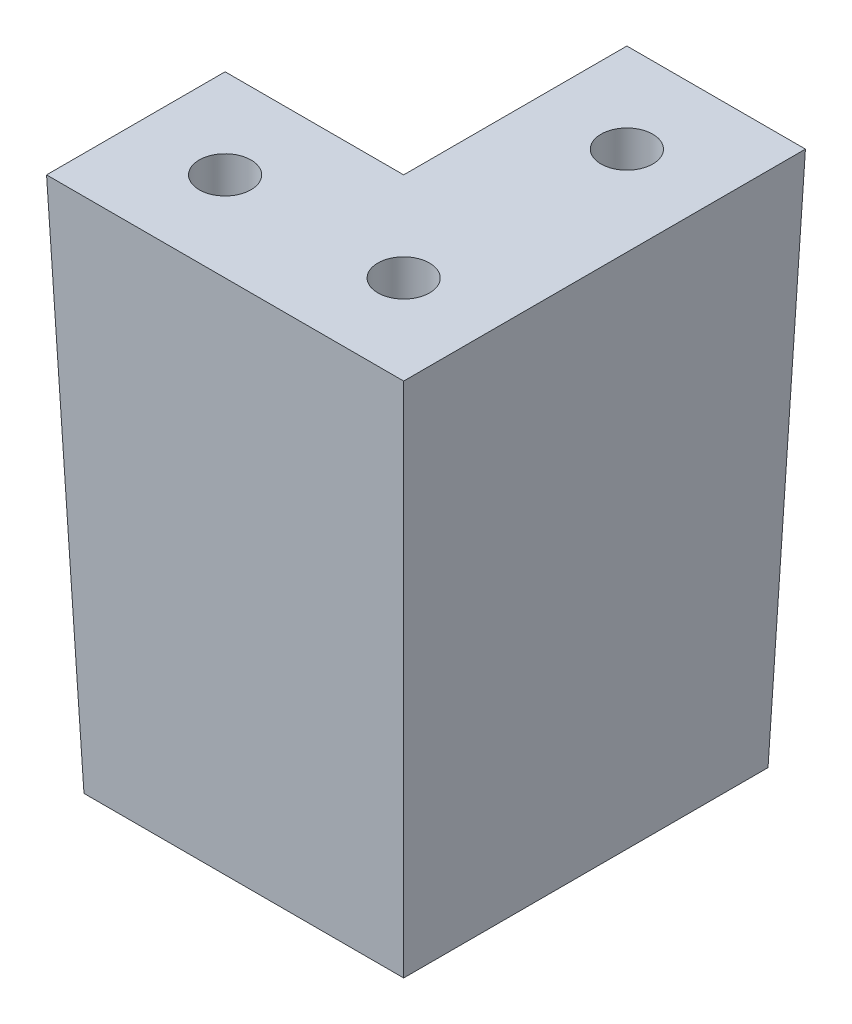
ISO-10303-21;
HEADER;
FILE_DESCRIPTION(('STEP AP214'),'2;1');
FILE_NAME('part.step','',(''),(''),'','','');
FILE_SCHEMA(('AUTOMOTIVE_DESIGN { 1 0 10303 214 1 1 1 1 }'));
ENDSEC;
DATA;
#1=APPLICATION_CONTEXT('core data for automotive mechanical design processes');
#2=APPLICATION_PROTOCOL_DEFINITION('international standard','automotive_design',2000,#1);
#3=PRODUCT_CONTEXT('',#1,'mechanical');
#4=PRODUCT('Part','Part','',(#3));
#5=PRODUCT_RELATED_PRODUCT_CATEGORY('part','',(#4));
#6=PRODUCT_DEFINITION_FORMATION('','',#4);
#7=PRODUCT_DEFINITION_CONTEXT('part definition',#1,'design');
#8=PRODUCT_DEFINITION('design','',#6,#7);
#9=PRODUCT_DEFINITION_SHAPE('','',#8);
#10=(LENGTH_UNIT() NAMED_UNIT(*) SI_UNIT(.MILLI.,.METRE.));
#11=(NAMED_UNIT(*) PLANE_ANGLE_UNIT() SI_UNIT($,.RADIAN.));
#12=(NAMED_UNIT(*) SI_UNIT($,.STERADIAN.) SOLID_ANGLE_UNIT());
#13=UNCERTAINTY_MEASURE_WITH_UNIT(LENGTH_MEASURE(1.E-05),#10,'distance_accuracy_value','');
#14=(GEOMETRIC_REPRESENTATION_CONTEXT(3) GLOBAL_UNCERTAINTY_ASSIGNED_CONTEXT((#13)) GLOBAL_UNIT_ASSIGNED_CONTEXT((#10,
#11,#12)) REPRESENTATION_CONTEXT('',''));
#15=CARTESIAN_POINT('',(0.,0.,0.));
#16=DIRECTION('',(0.,0.,1.));
#17=DIRECTION('',(1.,0.,0.));
#18=AXIS2_PLACEMENT_3D('',#15,#16,#17);
#19=CARTESIAN_POINT('',(0.,0.,0.));
#20=DIRECTION('',(-0.999390827019096,-0.034899496702501,0.));
#21=DIRECTION('',(0.034899496702501,-0.999390827019096,0.));
#22=AXIS2_PLACEMENT_3D('',#19,#20,#21);
#23=PLANE('',#22);
#24=DIRECTION('',(0.,0.,1.));
#25=VECTOR('',#24,1.);
#26=CARTESIAN_POINT('',(0.,0.,0.));
#27=LINE('',#26,#25);
#28=CARTESIAN_POINT('',(0.,0.,-20.));
#29=VERTEX_POINT('',#28);
#30=CARTESIAN_POINT('',(0.,0.,0.));
#31=VERTEX_POINT('',#30);
#32=EDGE_CURVE('E111',#29,#31,#27,.T.);
#33=ORIENTED_EDGE('',*,*,#32,.F.);
#34=DIRECTION('',(-0.0348782627423747,0.998782765958718,-0.0348782627423747));
#35=VECTOR('',#34,1.);
#36=CARTESIAN_POINT('',(0.,0.,-20.));
#37=LINE('',#36,#35);
#38=CARTESIAN_POINT('',(2.09524616950487,-60.,-17.9047538304951));
#39=VERTEX_POINT('',#38);
#40=EDGE_CURVE('E11',#39,#29,#37,.T.);
#41=ORIENTED_EDGE('',*,*,#40,.F.);
#42=DIRECTION('',(0.,0.,1.));
#43=VECTOR('',#42,1.);
#44=CARTESIAN_POINT('',(2.09524616950487,-60.,0.));
#45=LINE('',#44,#43);
#46=CARTESIAN_POINT('',(2.09524616950487,-60.,-2.09524616950487));
#47=VERTEX_POINT('',#46);
#48=EDGE_CURVE('E113',#39,#47,#45,.T.);
#49=ORIENTED_EDGE('',*,*,#48,.T.);
#50=DIRECTION('',(-0.0348782627423747,0.998782765958718,0.0348782627423747));
#51=VECTOR('',#50,1.);
#52=CARTESIAN_POINT('',(0.,0.,0.));
#53=LINE('',#52,#51);
#54=EDGE_CURVE('E89',#47,#31,#53,.T.);
#55=ORIENTED_EDGE('',*,*,#54,.T.);
#56=EDGE_LOOP('',(#33,#41,#49,#55));
#57=FACE_BOUND('',#56,.T.);
#58=ADVANCED_FACE('F43',(#57),#23,.T.);
#59=CARTESIAN_POINT('',(0.,0.,-20.));
#60=DIRECTION('',(0.,-0.034899496702501,-0.999390827019096));
#61=DIRECTION('',(0.,0.999390827019096,-0.034899496702501));
#62=AXIS2_PLACEMENT_3D('',#59,#60,#61);
#63=PLANE('',#62);
#64=DIRECTION('',(-1.,0.,0.));
#65=VECTOR('',#64,1.);
#66=CARTESIAN_POINT('',(0.,0.,-20.));
#67=LINE('',#66,#65);
#68=CARTESIAN_POINT('',(20.,0.,-20.));
#69=VERTEX_POINT('',#68);
#70=EDGE_CURVE('E126',#69,#29,#67,.T.);
#71=ORIENTED_EDGE('',*,*,#70,.F.);
#72=DIRECTION('',(-0.0348782627423747,0.998782765958718,-0.0348782627423747));
#73=VECTOR('',#72,1.);
#74=CARTESIAN_POINT('',(19.9756701357615,0.696716154673278,-20.0243298642385));
#75=LINE('',#74,#73);
#76=CARTESIAN_POINT('',(22.0952461695049,-60.,-17.9047538304951));
#77=VERTEX_POINT('',#76);
#78=EDGE_CURVE('E54',#77,#69,#75,.T.);
#79=ORIENTED_EDGE('',*,*,#78,.F.);
#80=DIRECTION('',(-1.,0.,0.));
#81=VECTOR('',#80,1.);
#82=CARTESIAN_POINT('',(0.,-60.,-17.9047538304951));
#83=LINE('',#82,#81);
#84=EDGE_CURVE('E115',#77,#39,#83,.T.);
#85=ORIENTED_EDGE('',*,*,#84,.T.);
#86=ORIENTED_EDGE('',*,*,#40,.T.);
#87=EDGE_LOOP('',(#71,#79,#85,#86));
#88=FACE_BOUND('',#87,.T.);
#89=ADVANCED_FACE('F45',(#88),#63,.T.);
#90=CARTESIAN_POINT('',(20.,0.,-45.));
#91=DIRECTION('',(-0.999390827019096,-0.034899496702501,0.));
#92=DIRECTION('',(0.034899496702501,-0.999390827019096,0.));
#93=AXIS2_PLACEMENT_3D('',#90,#91,#92);
#94=PLANE('',#93);
#95=DIRECTION('',(0.,0.,1.));
#96=VECTOR('',#95,1.);
#97=CARTESIAN_POINT('',(20.,0.,-45.));
#98=LINE('',#97,#96);
#99=CARTESIAN_POINT('',(20.,0.,-45.));
#100=VERTEX_POINT('',#99);
#101=EDGE_CURVE('E142',#100,#69,#98,.T.);
#102=ORIENTED_EDGE('',*,*,#101,.F.);
#103=DIRECTION('',(-0.0348782627423747,0.998782765958718,-0.0348782627423747));
#104=VECTOR('',#103,1.);
#105=CARTESIAN_POINT('',(20.,0.,-45.));
#106=LINE('',#105,#104);
#107=CARTESIAN_POINT('',(22.0952461695049,-60.,-42.9047538304951));
#108=VERTEX_POINT('',#107);
#109=EDGE_CURVE('E152',#108,#100,#106,.T.);
#110=ORIENTED_EDGE('',*,*,#109,.F.);
#111=DIRECTION('',(0.,0.,1.));
#112=VECTOR('',#111,1.);
#113=CARTESIAN_POINT('',(22.0952461695049,-60.,-45.));
#114=LINE('',#113,#112);
#115=EDGE_CURVE('E161',#108,#77,#114,.T.);
#116=ORIENTED_EDGE('',*,*,#115,.T.);
#117=ORIENTED_EDGE('',*,*,#78,.T.);
#118=EDGE_LOOP('',(#102,#110,#116,#117));
#119=FACE_BOUND('',#118,.T.);
#120=ADVANCED_FACE('F179',(#119),#94,.T.);
#121=CARTESIAN_POINT('',(20.,0.,-45.));
#122=DIRECTION('',(0.,-0.034899496702501,-0.999390827019096));
#123=DIRECTION('',(0.,0.999390827019096,-0.034899496702501));
#124=AXIS2_PLACEMENT_3D('',#121,#122,#123);
#125=PLANE('',#124);
#126=DIRECTION('',(-1.,0.,0.));
#127=VECTOR('',#126,1.);
#128=CARTESIAN_POINT('',(20.,0.,-45.));
#129=LINE('',#128,#127);
#130=CARTESIAN_POINT('',(40.,0.,-45.));
#131=VERTEX_POINT('',#130);
#132=EDGE_CURVE('E138',#131,#100,#129,.T.);
#133=ORIENTED_EDGE('',*,*,#132,.F.);
#134=DIRECTION('',(0.0348782627423747,0.998782765958718,-0.0348782627423747));
#135=VECTOR('',#134,1.);
#136=CARTESIAN_POINT('',(39.9452578054633,-1.56761134801487,-44.9452578054633));
#137=LINE('',#136,#135);
#138=CARTESIAN_POINT('',(37.9047538304951,-60.,-42.9047538304951));
#139=VERTEX_POINT('',#138);
#140=EDGE_CURVE('E149',#139,#131,#137,.T.);
#141=ORIENTED_EDGE('',*,*,#140,.F.);
#142=DIRECTION('',(-1.,0.,0.));
#143=VECTOR('',#142,1.);
#144=CARTESIAN_POINT('',(20.,-60.,-42.9047538304951));
#145=LINE('',#144,#143);
#146=EDGE_CURVE('E164',#139,#108,#145,.T.);
#147=ORIENTED_EDGE('',*,*,#146,.T.);
#148=ORIENTED_EDGE('',*,*,#109,.T.);
#149=EDGE_LOOP('',(#133,#141,#147,#148));
#150=FACE_BOUND('',#149,.T.);
#151=ADVANCED_FACE('F177',(#150),#125,.T.);
#152=CARTESIAN_POINT('',(40.,0.,0.));
#153=DIRECTION('',(0.999390827019096,-0.034899496702501,0.));
#154=DIRECTION('',(0.034899496702501,0.999390827019096,0.));
#155=AXIS2_PLACEMENT_3D('',#152,#153,#154);
#156=PLANE('',#155);
#157=DIRECTION('',(0.,0.,-1.));
#158=VECTOR('',#157,1.);
#159=CARTESIAN_POINT('',(40.,0.,0.));
#160=LINE('',#159,#158);
#161=CARTESIAN_POINT('',(40.,0.,0.));
#162=VERTEX_POINT('',#161);
#163=EDGE_CURVE('E123',#162,#131,#160,.T.);
#164=ORIENTED_EDGE('',*,*,#163,.F.);
#165=DIRECTION('',(0.0348782627423747,0.998782765958718,0.0348782627423747));
#166=VECTOR('',#165,1.);
#167=CARTESIAN_POINT('',(39.951340271523,-1.39343230934656,-0.0486597284770448));
#168=LINE('',#167,#166);
#169=CARTESIAN_POINT('',(37.9047538304951,-60.,-2.09524616950487));
#170=VERTEX_POINT('',#169);
#171=EDGE_CURVE('E81',#170,#162,#168,.T.);
#172=ORIENTED_EDGE('',*,*,#171,.F.);
#173=DIRECTION('',(0.,0.,-1.));
#174=VECTOR('',#173,1.);
#175=CARTESIAN_POINT('',(37.9047538304951,-60.,0.));
#176=LINE('',#175,#174);
#177=EDGE_CURVE('E167',#170,#139,#176,.T.);
#178=ORIENTED_EDGE('',*,*,#177,.T.);
#179=ORIENTED_EDGE('',*,*,#140,.T.);
#180=EDGE_LOOP('',(#164,#172,#178,#179));
#181=FACE_BOUND('',#180,.T.);
#182=ADVANCED_FACE('F178',(#181),#156,.T.);
#183=CARTESIAN_POINT('',(0.,0.,0.));
#184=DIRECTION('',(0.,-0.034899496702501,0.999390827019096));
#185=DIRECTION('',(0.,-0.999390827019096,-0.034899496702501));
#186=AXIS2_PLACEMENT_3D('',#183,#184,#185);
#187=PLANE('',#186);
#188=DIRECTION('',(1.,0.,0.));
#189=VECTOR('',#188,1.);
#190=CARTESIAN_POINT('',(0.,0.,0.));
#191=LINE('',#190,#189);
#192=EDGE_CURVE('E118',#31,#162,#191,.T.);
#193=ORIENTED_EDGE('',*,*,#192,.F.);
#194=ORIENTED_EDGE('',*,*,#54,.F.);
#195=DIRECTION('',(1.,0.,0.));
#196=VECTOR('',#195,1.);
#197=CARTESIAN_POINT('',(0.,-60.,-2.09524616950487));
#198=LINE('',#197,#196);
#199=EDGE_CURVE('E47',#47,#170,#198,.T.);
#200=ORIENTED_EDGE('',*,*,#199,.T.);
#201=ORIENTED_EDGE('',*,*,#171,.T.);
#202=EDGE_LOOP('',(#193,#194,#200,#201));
#203=FACE_BOUND('',#202,.T.);
#204=ADVANCED_FACE('F119',(#203),#187,.T.);
#205=CARTESIAN_POINT('',(0.,-60.,0.));
#206=DIRECTION('',(0.,-1.,0.));
#207=DIRECTION('',(0.,0.,-1.));
#208=AXIS2_PLACEMENT_3D('',#205,#206,#207);
#209=PLANE('',#208);
#210=CARTESIAN_POINT('',(30.0000000000011,-60.,-10.));
#211=DIRECTION('',(0.,-1.,0.));
#212=DIRECTION('',(0.,0.,-1.));
#213=AXIS2_PLACEMENT_3D('',#210,#211,#212);
#214=CIRCLE('',#213,5.74999999999999);
#215=CARTESIAN_POINT('',(30.0000000000011,-60.,-15.75));
#216=VERTEX_POINT('',#215);
#217=EDGE_CURVE('E342',#216,#216,#214,.T.);
#218=ORIENTED_EDGE('',*,*,#217,.F.);
#219=EDGE_LOOP('',(#218));
#220=FACE_BOUND('',#219,.T.);
#221=CARTESIAN_POINT('',(9.99999999999545,-60.,-10.));
#222=DIRECTION('',(0.,-1.,0.));
#223=DIRECTION('',(0.,0.,-1.));
#224=AXIS2_PLACEMENT_3D('',#221,#222,#223);
#225=CIRCLE('',#224,5.74999999999999);
#226=CARTESIAN_POINT('',(9.99999999999545,-60.,-15.75));
#227=VERTEX_POINT('',#226);
#228=EDGE_CURVE('E356',#227,#227,#225,.T.);
#229=ORIENTED_EDGE('',*,*,#228,.F.);
#230=EDGE_LOOP('',(#229));
#231=FACE_BOUND('',#230,.T.);
#232=CARTESIAN_POINT('',(30.0000000007019,-60.,-35.));
#233=DIRECTION('',(0.,-1.,0.));
#234=DIRECTION('',(0.,0.,-1.));
#235=AXIS2_PLACEMENT_3D('',#232,#233,#234);
#236=CIRCLE('',#235,5.75);
#237=CARTESIAN_POINT('',(30.0000000007019,-60.,-40.75));
#238=VERTEX_POINT('',#237);
#239=EDGE_CURVE('E372',#238,#238,#236,.T.);
#240=ORIENTED_EDGE('',*,*,#239,.F.);
#241=EDGE_LOOP('',(#240));
#242=FACE_BOUND('',#241,.T.);
#243=ORIENTED_EDGE('',*,*,#48,.F.);
#244=ORIENTED_EDGE('',*,*,#84,.F.);
#245=ORIENTED_EDGE('',*,*,#115,.F.);
#246=ORIENTED_EDGE('',*,*,#146,.F.);
#247=ORIENTED_EDGE('',*,*,#177,.F.);
#248=ORIENTED_EDGE('',*,*,#199,.F.);
#249=EDGE_LOOP('',(#243,#244,#245,#246,#247,#248));
#250=FACE_BOUND('',#249,.T.);
#251=ADVANCED_FACE('F171',(#220,#231,#242,#250),#209,.T.);
#252=CARTESIAN_POINT('',(0.,0.,0.));
#253=DIRECTION('',(0.,-1.,0.));
#254=DIRECTION('',(0.,0.,-1.));
#255=AXIS2_PLACEMENT_3D('',#252,#253,#254);
#256=PLANE('',#255);
#257=CARTESIAN_POINT('',(30.0000000000011,0.,-10.));
#258=DIRECTION('',(0.,-1.,0.));
#259=DIRECTION('',(0.,0.,-1.));
#260=AXIS2_PLACEMENT_3D('',#257,#258,#259);
#261=CIRCLE('',#260,2.89999999999999);
#262=CARTESIAN_POINT('',(30.0000000000011,0.,-12.9));
#263=VERTEX_POINT('',#262);
#264=EDGE_CURVE('E352',#263,#263,#261,.T.);
#265=ORIENTED_EDGE('',*,*,#264,.T.);
#266=EDGE_LOOP('',(#265));
#267=FACE_BOUND('',#266,.T.);
#268=CARTESIAN_POINT('',(9.99999999999545,0.,-10.));
#269=DIRECTION('',(0.,-1.,0.));
#270=DIRECTION('',(0.,0.,-1.));
#271=AXIS2_PLACEMENT_3D('',#268,#269,#270);
#272=CIRCLE('',#271,2.89999999999999);
#273=CARTESIAN_POINT('',(9.99999999999545,0.,-12.9));
#274=VERTEX_POINT('',#273);
#275=EDGE_CURVE('E368',#274,#274,#272,.T.);
#276=ORIENTED_EDGE('',*,*,#275,.T.);
#277=EDGE_LOOP('',(#276));
#278=FACE_BOUND('',#277,.T.);
#279=CARTESIAN_POINT('',(30.0000000007019,0.,-35.));
#280=DIRECTION('',(0.,-1.,0.));
#281=DIRECTION('',(0.,0.,-1.));
#282=AXIS2_PLACEMENT_3D('',#279,#280,#281);
#283=CIRCLE('',#282,2.89999999999999);
#284=CARTESIAN_POINT('',(30.0000000007019,0.,-37.9));
#285=VERTEX_POINT('',#284);
#286=EDGE_CURVE('E128',#285,#285,#283,.T.);
#287=ORIENTED_EDGE('',*,*,#286,.T.);
#288=EDGE_LOOP('',(#287));
#289=FACE_BOUND('',#288,.T.);
#290=ORIENTED_EDGE('',*,*,#32,.T.);
#291=ORIENTED_EDGE('',*,*,#192,.T.);
#292=ORIENTED_EDGE('',*,*,#163,.T.);
#293=ORIENTED_EDGE('',*,*,#132,.T.);
#294=ORIENTED_EDGE('',*,*,#101,.T.);
#295=ORIENTED_EDGE('',*,*,#70,.T.);
#296=EDGE_LOOP('',(#290,#291,#292,#293,#294,#295));
#297=FACE_BOUND('',#296,.T.);
#298=ADVANCED_FACE('F125',(#267,#278,#289,#297),#256,.F.);
#299=CARTESIAN_POINT('',(30.0000000007019,-60.,-35.));
#300=DIRECTION('',(0.,-1.,0.));
#301=DIRECTION('',(0.,0.,-1.));
#302=AXIS2_PLACEMENT_3D('',#299,#300,#301);
#303=CYLINDRICAL_SURFACE('',#302,2.89999999999999);
#304=ORIENTED_EDGE('',*,*,#286,.F.);
#305=EDGE_LOOP('',(#304));
#306=FACE_BOUND('',#305,.T.);
#307=CARTESIAN_POINT('',(30.0000000007019,-5.,-35.));
#308=DIRECTION('',(0.,-1.,0.));
#309=DIRECTION('',(0.,0.,-1.));
#310=AXIS2_PLACEMENT_3D('',#307,#308,#309);
#311=CIRCLE('',#310,2.89999999999999);
#312=CARTESIAN_POINT('',(30.0000000007019,-5.,-37.9));
#313=VERTEX_POINT('',#312);
#314=EDGE_CURVE('E132',#313,#313,#311,.T.);
#315=ORIENTED_EDGE('',*,*,#314,.T.);
#316=EDGE_LOOP('',(#315));
#317=FACE_BOUND('',#316,.T.);
#318=ADVANCED_FACE('F217',(#306,#317),#303,.F.);
#319=CARTESIAN_POINT('',(32.9000000007019,-5.,-35.));
#320=DIRECTION('',(0.,1.,0.));
#321=DIRECTION('',(0.,0.,1.));
#322=AXIS2_PLACEMENT_3D('',#319,#320,#321);
#323=PLANE('',#322);
#324=ORIENTED_EDGE('',*,*,#314,.F.);
#325=EDGE_LOOP('',(#324));
#326=FACE_BOUND('',#325,.T.);
#327=CARTESIAN_POINT('',(30.0000000007019,-5.,-35.));
#328=DIRECTION('',(0.,-1.,0.));
#329=DIRECTION('',(0.,0.,-1.));
#330=AXIS2_PLACEMENT_3D('',#327,#328,#329);
#331=CIRCLE('',#330,5.74999999999998);
#332=CARTESIAN_POINT('',(30.0000000007019,-5.,-40.75));
#333=VERTEX_POINT('',#332);
#334=EDGE_CURVE('E376',#333,#333,#331,.T.);
#335=ORIENTED_EDGE('',*,*,#334,.T.);
#336=EDGE_LOOP('',(#335));
#337=FACE_BOUND('',#336,.T.);
#338=ADVANCED_FACE('F224',(#326,#337),#323,.F.);
#339=CARTESIAN_POINT('',(30.0000000007019,-60.,-35.));
#340=DIRECTION('',(0.,-1.,0.));
#341=DIRECTION('',(0.,0.,-1.));
#342=AXIS2_PLACEMENT_3D('',#339,#340,#341);
#343=CYLINDRICAL_SURFACE('',#342,5.74999999999999);
#344=ORIENTED_EDGE('',*,*,#334,.F.);
#345=EDGE_LOOP('',(#344));
#346=FACE_BOUND('',#345,.T.);
#347=ORIENTED_EDGE('',*,*,#239,.T.);
#348=EDGE_LOOP('',(#347));
#349=FACE_BOUND('',#348,.T.);
#350=ADVANCED_FACE('F232',(#346,#349),#343,.F.);
#351=CARTESIAN_POINT('',(9.99999999999545,-60.,-10.));
#352=DIRECTION('',(0.,-1.,0.));
#353=DIRECTION('',(0.,0.,-1.));
#354=AXIS2_PLACEMENT_3D('',#351,#352,#353);
#355=CYLINDRICAL_SURFACE('',#354,2.89999999999999);
#356=ORIENTED_EDGE('',*,*,#275,.F.);
#357=EDGE_LOOP('',(#356));
#358=FACE_BOUND('',#357,.T.);
#359=CARTESIAN_POINT('',(9.99999999999545,-5.,-10.));
#360=DIRECTION('',(0.,-1.,0.));
#361=DIRECTION('',(0.,0.,-1.));
#362=AXIS2_PLACEMENT_3D('',#359,#360,#361);
#363=CIRCLE('',#362,2.89999999999999);
#364=CARTESIAN_POINT('',(9.99999999999545,-5.,-12.9));
#365=VERTEX_POINT('',#364);
#366=EDGE_CURVE('E364',#365,#365,#363,.T.);
#367=ORIENTED_EDGE('',*,*,#366,.T.);
#368=EDGE_LOOP('',(#367));
#369=FACE_BOUND('',#368,.T.);
#370=ADVANCED_FACE('F240',(#358,#369),#355,.F.);
#371=CARTESIAN_POINT('',(12.8999999999954,-5.,-10.));
#372=DIRECTION('',(0.,1.,0.));
#373=DIRECTION('',(0.,0.,1.));
#374=AXIS2_PLACEMENT_3D('',#371,#372,#373);
#375=PLANE('',#374);
#376=ORIENTED_EDGE('',*,*,#366,.F.);
#377=EDGE_LOOP('',(#376));
#378=FACE_BOUND('',#377,.T.);
#379=CARTESIAN_POINT('',(9.99999999999545,-5.,-10.));
#380=DIRECTION('',(0.,-1.,0.));
#381=DIRECTION('',(0.,0.,-1.));
#382=AXIS2_PLACEMENT_3D('',#379,#380,#381);
#383=CIRCLE('',#382,5.74999999999999);
#384=CARTESIAN_POINT('',(9.99999999999545,-5.,-15.75));
#385=VERTEX_POINT('',#384);
#386=EDGE_CURVE('E360',#385,#385,#383,.T.);
#387=ORIENTED_EDGE('',*,*,#386,.T.);
#388=EDGE_LOOP('',(#387));
#389=FACE_BOUND('',#388,.T.);
#390=ADVANCED_FACE('F248',(#378,#389),#375,.F.);
#391=CARTESIAN_POINT('',(9.99999999999545,-60.,-10.));
#392=DIRECTION('',(0.,-1.,0.));
#393=DIRECTION('',(0.,0.,-1.));
#394=AXIS2_PLACEMENT_3D('',#391,#392,#393);
#395=CYLINDRICAL_SURFACE('',#394,5.74999999999999);
#396=ORIENTED_EDGE('',*,*,#386,.F.);
#397=EDGE_LOOP('',(#396));
#398=FACE_BOUND('',#397,.T.);
#399=ORIENTED_EDGE('',*,*,#228,.T.);
#400=EDGE_LOOP('',(#399));
#401=FACE_BOUND('',#400,.T.);
#402=ADVANCED_FACE('F256',(#398,#401),#395,.F.);
#403=CARTESIAN_POINT('',(30.0000000000011,-60.,-10.));
#404=DIRECTION('',(0.,-1.,0.));
#405=DIRECTION('',(0.,0.,-1.));
#406=AXIS2_PLACEMENT_3D('',#403,#404,#405);
#407=CYLINDRICAL_SURFACE('',#406,2.89999999999999);
#408=ORIENTED_EDGE('',*,*,#264,.F.);
#409=EDGE_LOOP('',(#408));
#410=FACE_BOUND('',#409,.T.);
#411=CARTESIAN_POINT('',(30.0000000000011,-5.,-10.));
#412=DIRECTION('',(0.,-1.,0.));
#413=DIRECTION('',(0.,0.,-1.));
#414=AXIS2_PLACEMENT_3D('',#411,#412,#413);
#415=CIRCLE('',#414,2.89999999999999);
#416=CARTESIAN_POINT('',(30.0000000000011,-5.,-12.9));
#417=VERTEX_POINT('',#416);
#418=EDGE_CURVE('E346',#417,#417,#415,.T.);
#419=ORIENTED_EDGE('',*,*,#418,.T.);
#420=EDGE_LOOP('',(#419));
#421=FACE_BOUND('',#420,.T.);
#422=ADVANCED_FACE('F264',(#410,#421),#407,.F.);
#423=CARTESIAN_POINT('',(32.9000000000011,-5.,-10.));
#424=DIRECTION('',(0.,1.,0.));
#425=DIRECTION('',(0.,0.,1.));
#426=AXIS2_PLACEMENT_3D('',#423,#424,#425);
#427=PLANE('',#426);
#428=ORIENTED_EDGE('',*,*,#418,.F.);
#429=EDGE_LOOP('',(#428));
#430=FACE_BOUND('',#429,.T.);
#431=CARTESIAN_POINT('',(30.0000000000011,-5.,-10.));
#432=DIRECTION('',(0.,-1.,0.));
#433=DIRECTION('',(0.,0.,-1.));
#434=AXIS2_PLACEMENT_3D('',#431,#432,#433);
#435=CIRCLE('',#434,5.74999999999999);
#436=CARTESIAN_POINT('',(30.0000000000011,-5.,-15.75));
#437=VERTEX_POINT('',#436);
#438=EDGE_CURVE('E339',#437,#437,#435,.T.);
#439=ORIENTED_EDGE('',*,*,#438,.T.);
#440=EDGE_LOOP('',(#439));
#441=FACE_BOUND('',#440,.T.);
#442=ADVANCED_FACE('F272',(#430,#441),#427,.F.);
#443=CARTESIAN_POINT('',(30.0000000000011,-60.,-10.));
#444=DIRECTION('',(0.,-1.,0.));
#445=DIRECTION('',(0.,0.,-1.));
#446=AXIS2_PLACEMENT_3D('',#443,#444,#445);
#447=CYLINDRICAL_SURFACE('',#446,5.74999999999999);
#448=ORIENTED_EDGE('',*,*,#438,.F.);
#449=EDGE_LOOP('',(#448));
#450=FACE_BOUND('',#449,.T.);
#451=ORIENTED_EDGE('',*,*,#217,.T.);
#452=EDGE_LOOP('',(#451));
#453=FACE_BOUND('',#452,.T.);
#454=ADVANCED_FACE('F280',(#450,#453),#447,.F.);
#455=CLOSED_SHELL('',(#58,#89,#120,#151,#182,#204,#251,#298,#318,#338,#350,#370,#390,#402,#422,
#442,#454));
#456=MANIFOLD_SOLID_BREP('B2',#455);
#457=ADVANCED_BREP_SHAPE_REPRESENTATION('',(#18,#456),#14);
#458=SHAPE_DEFINITION_REPRESENTATION(#9,#457);
ENDSEC;
END-ISO-10303-21;
